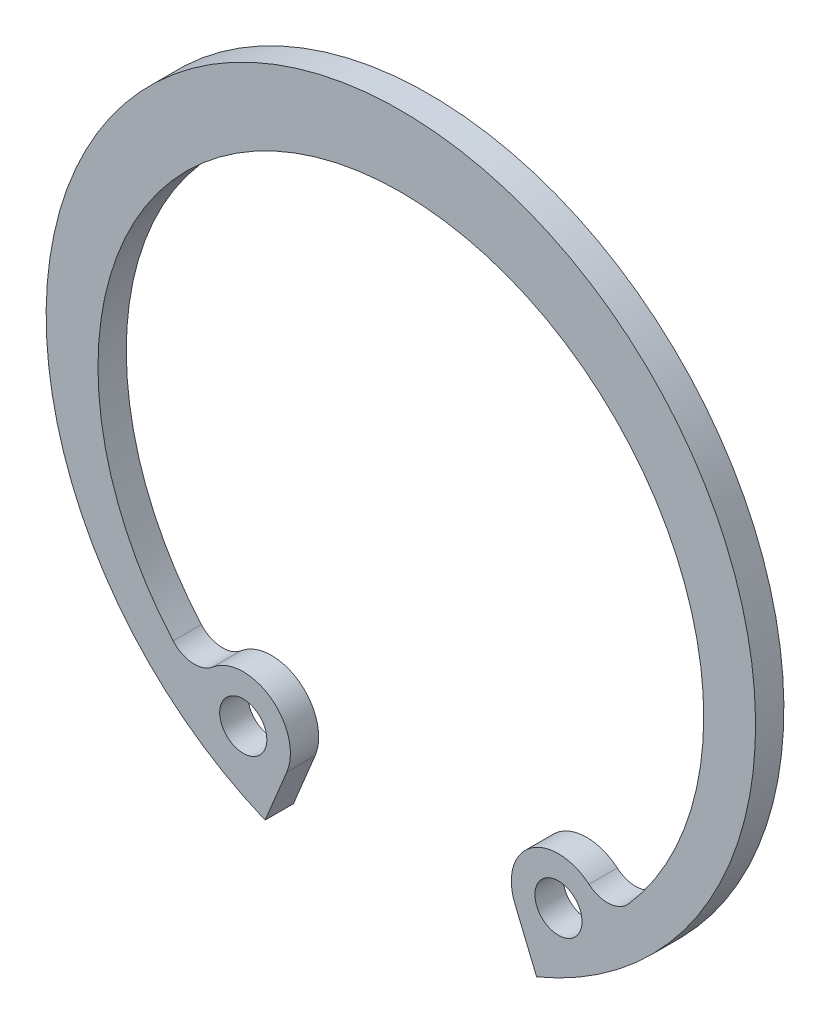
ISO-10303-21;
HEADER;
FILE_DESCRIPTION(('STEP AP214'),'2;1');
FILE_NAME('part.step','',(''),(''),'','','');
FILE_SCHEMA(('AUTOMOTIVE_DESIGN { 1 0 10303 214 1 1 1 1 }'));
ENDSEC;
DATA;
#1=APPLICATION_CONTEXT('core data for automotive mechanical design processes');
#2=APPLICATION_PROTOCOL_DEFINITION('international standard','automotive_design',2000,#1);
#3=PRODUCT_CONTEXT('',#1,'mechanical');
#4=PRODUCT('Part','Part','',(#3));
#5=PRODUCT_RELATED_PRODUCT_CATEGORY('part','',(#4));
#6=PRODUCT_DEFINITION_FORMATION('','',#4);
#7=PRODUCT_DEFINITION_CONTEXT('part definition',#1,'design');
#8=PRODUCT_DEFINITION('design','',#6,#7);
#9=PRODUCT_DEFINITION_SHAPE('','',#8);
#10=(LENGTH_UNIT() NAMED_UNIT(*) SI_UNIT(.MILLI.,.METRE.));
#11=(NAMED_UNIT(*) PLANE_ANGLE_UNIT() SI_UNIT($,.RADIAN.));
#12=(NAMED_UNIT(*) SI_UNIT($,.STERADIAN.) SOLID_ANGLE_UNIT());
#13=UNCERTAINTY_MEASURE_WITH_UNIT(LENGTH_MEASURE(1.E-05),#10,'distance_accuracy_value','');
#14=(GEOMETRIC_REPRESENTATION_CONTEXT(3) GLOBAL_UNCERTAINTY_ASSIGNED_CONTEXT((#13)) GLOBAL_UNIT_ASSIGNED_CONTEXT((#10,
#11,#12)) REPRESENTATION_CONTEXT('',''));
#15=CARTESIAN_POINT('',(0.,0.,0.));
#16=DIRECTION('',(0.,0.,1.));
#17=DIRECTION('',(1.,0.,0.));
#18=AXIS2_PLACEMENT_3D('',#15,#16,#17);
#19=CARTESIAN_POINT('',(0.,0.,-1.2));
#20=DIRECTION('',(0.,0.,1.));
#21=DIRECTION('',(1.,0.,0.));
#22=AXIS2_PLACEMENT_3D('',#19,#20,#21);
#23=CYLINDRICAL_SURFACE('',#22,15.05);
#24=CARTESIAN_POINT('',(0.,0.,0.));
#25=DIRECTION('',(0.,0.,1.));
#26=DIRECTION('',(1.,0.,0.));
#27=AXIS2_PLACEMENT_3D('',#24,#25,#26);
#28=CIRCLE('',#27,15.05);
#29=CARTESIAN_POINT('',(5.75938565709461,-13.9043869642949,0.));
#30=VERTEX_POINT('',#29);
#31=CARTESIAN_POINT('',(-5.75938565709461,-13.9043869642949,0.));
#32=VERTEX_POINT('',#31);
#33=EDGE_CURVE('E158',#30,#32,#28,.T.);
#34=ORIENTED_EDGE('',*,*,#33,.F.);
#35=DIRECTION('',(0.,0.,1.));
#36=VECTOR('',#35,1.);
#37=CARTESIAN_POINT('',(5.75938565709461,-13.9043869642949,-1.2));
#38=LINE('',#37,#36);
#39=CARTESIAN_POINT('',(5.75938565709461,-13.9043869642949,-1.2));
#40=VERTEX_POINT('',#39);
#41=EDGE_CURVE('E11',#40,#30,#38,.T.);
#42=ORIENTED_EDGE('',*,*,#41,.F.);
#43=CARTESIAN_POINT('',(0.,0.,-1.2));
#44=DIRECTION('',(0.,0.,1.));
#45=DIRECTION('',(1.,0.,0.));
#46=AXIS2_PLACEMENT_3D('',#43,#44,#45);
#47=CIRCLE('',#46,15.05);
#48=CARTESIAN_POINT('',(-5.75938565709461,-13.9043869642949,-1.2));
#49=VERTEX_POINT('',#48);
#50=EDGE_CURVE('E187',#40,#49,#47,.T.);
#51=ORIENTED_EDGE('',*,*,#50,.T.);
#52=DIRECTION('',(0.,0.,1.));
#53=VECTOR('',#52,1.);
#54=CARTESIAN_POINT('',(-5.75938565709461,-13.9043869642949,-1.2));
#55=LINE('',#54,#53);
#56=EDGE_CURVE('E44',#49,#32,#55,.T.);
#57=ORIENTED_EDGE('',*,*,#56,.T.);
#58=EDGE_LOOP('',(#34,#42,#51,#57));
#59=FACE_BOUND('',#58,.T.);
#60=ADVANCED_FACE('F41',(#59),#23,.T.);
#61=CARTESIAN_POINT('',(4.8381841684222,-11.6804098366636,-1.2));
#62=DIRECTION('',(-0.923879532511287,-0.38268343236509,0.));
#63=DIRECTION('',(0.38268343236509,-0.923879532511287,0.));
#64=AXIS2_PLACEMENT_3D('',#61,#62,#63);
#65=PLANE('',#64);
#66=DIRECTION('',(0.38268343236509,-0.923879532511287,0.));
#67=VECTOR('',#66,1.);
#68=CARTESIAN_POINT('',(4.8381841684222,-11.6804098366636,0.));
#69=LINE('',#68,#67);
#70=CARTESIAN_POINT('',(4.83818416842221,-11.6804098366636,0.));
#71=VERTEX_POINT('',#70);
#72=EDGE_CURVE('E184',#71,#30,#69,.T.);
#73=ORIENTED_EDGE('',*,*,#72,.F.);
#74=DIRECTION('',(0.,0.,1.));
#75=VECTOR('',#74,1.);
#76=CARTESIAN_POINT('',(4.83818416842221,-11.6804098366636,-1.2));
#77=LINE('',#76,#75);
#78=CARTESIAN_POINT('',(4.83818416842221,-11.6804098366636,-1.2));
#79=VERTEX_POINT('',#78);
#80=EDGE_CURVE('E51',#79,#71,#77,.T.);
#81=ORIENTED_EDGE('',*,*,#80,.F.);
#82=DIRECTION('',(0.38268343236509,-0.923879532511287,0.));
#83=VECTOR('',#82,1.);
#84=CARTESIAN_POINT('',(4.8381841684222,-11.6804098366636,-1.2));
#85=LINE('',#84,#83);
#86=EDGE_CURVE('E143',#79,#40,#85,.T.);
#87=ORIENTED_EDGE('',*,*,#86,.T.);
#88=ORIENTED_EDGE('',*,*,#41,.T.);
#89=EDGE_LOOP('',(#73,#81,#87,#88));
#90=FACE_BOUND('',#89,.T.);
#91=ADVANCED_FACE('F204',(#90),#65,.T.);
#92=CARTESIAN_POINT('',(6.68594323344478,-10.9150429719335,-1.2));
#93=DIRECTION('',(0.,0.,1.));
#94=DIRECTION('',(1.,0.,0.));
#95=AXIS2_PLACEMENT_3D('',#92,#93,#94);
#96=CYLINDRICAL_SURFACE('',#95,2.);
#97=CARTESIAN_POINT('',(6.68594323344478,-10.9150429719335,0.));
#98=DIRECTION('',(0.,0.,1.));
#99=DIRECTION('',(-1.,0.,0.));
#100=AXIS2_PLACEMENT_3D('',#97,#98,#99);
#101=CIRCLE('',#100,2.);
#102=CARTESIAN_POINT('',(7.98284993233138,-9.39253418234207,0.));
#103=VERTEX_POINT('',#102);
#104=EDGE_CURVE('E129',#103,#71,#101,.T.);
#105=ORIENTED_EDGE('',*,*,#104,.F.);
#106=DIRECTION('',(0.,0.,1.));
#107=VECTOR('',#106,1.);
#108=CARTESIAN_POINT('',(7.98284993233138,-9.39253418234207,-1.2));
#109=LINE('',#108,#107);
#110=CARTESIAN_POINT('',(7.98284993233138,-9.39253418234207,-1.2));
#111=VERTEX_POINT('',#110);
#112=EDGE_CURVE('E124',#111,#103,#109,.T.);
#113=ORIENTED_EDGE('',*,*,#112,.F.);
#114=CARTESIAN_POINT('',(6.68594323344478,-10.9150429719335,-1.2));
#115=DIRECTION('',(0.,0.,1.));
#116=DIRECTION('',(-1.,0.,0.));
#117=AXIS2_PLACEMENT_3D('',#114,#115,#116);
#118=CIRCLE('',#117,2.);
#119=EDGE_CURVE('E127',#111,#79,#118,.T.);
#120=ORIENTED_EDGE('',*,*,#119,.T.);
#121=ORIENTED_EDGE('',*,*,#80,.T.);
#122=EDGE_LOOP('',(#105,#113,#120,#121));
#123=FACE_BOUND('',#122,.T.);
#124=ADVANCED_FACE('F126',(#123),#96,.T.);
#125=CARTESIAN_POINT('',(8.76099395166334,-8.47902890858723,-1.2));
#126=DIRECTION('',(0.,0.,1.));
#127=DIRECTION('',(1.,0.,0.));
#128=AXIS2_PLACEMENT_3D('',#125,#126,#127);
#129=CYLINDRICAL_SURFACE('',#128,1.2);
#130=CARTESIAN_POINT('',(8.76099395166334,-8.47902890858723,0.));
#131=DIRECTION('',(0.,0.,-1.));
#132=DIRECTION('',(-1.,0.,0.));
#133=AXIS2_PLACEMENT_3D('',#130,#131,#132);
#134=CIRCLE('',#133,1.2);
#135=CARTESIAN_POINT('',(9.66341392951708,-9.27000184337733,0.));
#136=VERTEX_POINT('',#135);
#137=EDGE_CURVE('E179',#136,#103,#134,.T.);
#138=ORIENTED_EDGE('',*,*,#137,.F.);
#139=DIRECTION('',(0.,0.,1.));
#140=VECTOR('',#139,1.);
#141=CARTESIAN_POINT('',(9.66341392951708,-9.27000184337733,-1.2));
#142=LINE('',#141,#140);
#143=CARTESIAN_POINT('',(9.66341392951708,-9.27000184337733,-1.2));
#144=VERTEX_POINT('',#143);
#145=EDGE_CURVE('E135',#144,#136,#142,.T.);
#146=ORIENTED_EDGE('',*,*,#145,.F.);
#147=CARTESIAN_POINT('',(8.76099395166334,-8.47902890858723,-1.2));
#148=DIRECTION('',(0.,0.,-1.));
#149=DIRECTION('',(-1.,0.,0.));
#150=AXIS2_PLACEMENT_3D('',#147,#148,#149);
#151=CIRCLE('',#150,1.2);
#152=EDGE_CURVE('E141',#144,#111,#151,.T.);
#153=ORIENTED_EDGE('',*,*,#152,.T.);
#154=ORIENTED_EDGE('',*,*,#112,.T.);
#155=EDGE_LOOP('',(#138,#146,#153,#154));
#156=FACE_BOUND('',#155,.T.);
#157=ADVANCED_FACE('F146',(#156),#129,.F.);
#158=CARTESIAN_POINT('',(0.,-0.8,-1.2));
#159=DIRECTION('',(0.,0.,1.));
#160=DIRECTION('',(1.,0.,0.));
#161=AXIS2_PLACEMENT_3D('',#158,#159,#160);
#162=CYLINDRICAL_SURFACE('',#161,12.85);
#163=CARTESIAN_POINT('',(0.,-0.8,0.));
#164=DIRECTION('',(0.,0.,-1.));
#165=DIRECTION('',(1.,0.,0.));
#166=AXIS2_PLACEMENT_3D('',#163,#164,#165);
#167=CIRCLE('',#166,12.85);
#168=CARTESIAN_POINT('',(-9.66341392951707,-9.27000184337733,0.));
#169=VERTEX_POINT('',#168);
#170=EDGE_CURVE('E175',#169,#136,#167,.T.);
#171=ORIENTED_EDGE('',*,*,#170,.F.);
#172=DIRECTION('',(0.,0.,1.));
#173=VECTOR('',#172,1.);
#174=CARTESIAN_POINT('',(-9.66341392951707,-9.27000184337733,-1.2));
#175=LINE('',#174,#173);
#176=CARTESIAN_POINT('',(-9.66341392951707,-9.27000184337733,-1.2));
#177=VERTEX_POINT('',#176);
#178=EDGE_CURVE('E193',#177,#169,#175,.T.);
#179=ORIENTED_EDGE('',*,*,#178,.F.);
#180=CARTESIAN_POINT('',(0.,-0.8,-1.2));
#181=DIRECTION('',(0.,0.,-1.));
#182=DIRECTION('',(1.,0.,0.));
#183=AXIS2_PLACEMENT_3D('',#180,#181,#182);
#184=CIRCLE('',#183,12.85);
#185=EDGE_CURVE('E148',#177,#144,#184,.T.);
#186=ORIENTED_EDGE('',*,*,#185,.T.);
#187=ORIENTED_EDGE('',*,*,#145,.T.);
#188=EDGE_LOOP('',(#171,#179,#186,#187));
#189=FACE_BOUND('',#188,.T.);
#190=ADVANCED_FACE('F217',(#189),#162,.F.);
#191=CARTESIAN_POINT('',(-8.76099395166334,-8.47902890858723,-1.2));
#192=DIRECTION('',(0.,0.,1.));
#193=DIRECTION('',(1.,0.,0.));
#194=AXIS2_PLACEMENT_3D('',#191,#192,#193);
#195=CYLINDRICAL_SURFACE('',#194,1.2);
#196=CARTESIAN_POINT('',(-8.76099395166334,-8.47902890858723,0.));
#197=DIRECTION('',(0.,0.,-1.));
#198=DIRECTION('',(1.,0.,0.));
#199=AXIS2_PLACEMENT_3D('',#196,#197,#198);
#200=CIRCLE('',#199,1.2);
#201=CARTESIAN_POINT('',(-7.98284993233138,-9.39253418234207,0.));
#202=VERTEX_POINT('',#201);
#203=EDGE_CURVE('E171',#202,#169,#200,.T.);
#204=ORIENTED_EDGE('',*,*,#203,.F.);
#205=DIRECTION('',(0.,0.,1.));
#206=VECTOR('',#205,1.);
#207=CARTESIAN_POINT('',(-7.98284993233138,-9.39253418234207,-1.2));
#208=LINE('',#207,#206);
#209=CARTESIAN_POINT('',(-7.98284993233138,-9.39253418234207,-1.2));
#210=VERTEX_POINT('',#209);
#211=EDGE_CURVE('E196',#210,#202,#208,.T.);
#212=ORIENTED_EDGE('',*,*,#211,.F.);
#213=CARTESIAN_POINT('',(-8.76099395166334,-8.47902890858723,-1.2));
#214=DIRECTION('',(0.,0.,-1.));
#215=DIRECTION('',(1.,0.,0.));
#216=AXIS2_PLACEMENT_3D('',#213,#214,#215);
#217=CIRCLE('',#216,1.2);
#218=EDGE_CURVE('E152',#210,#177,#217,.T.);
#219=ORIENTED_EDGE('',*,*,#218,.T.);
#220=ORIENTED_EDGE('',*,*,#178,.T.);
#221=EDGE_LOOP('',(#204,#212,#219,#220));
#222=FACE_BOUND('',#221,.T.);
#223=ADVANCED_FACE('F220',(#222),#195,.F.);
#224=CARTESIAN_POINT('',(-6.68594323344477,-10.9150429719335,-1.2));
#225=DIRECTION('',(0.,0.,1.));
#226=DIRECTION('',(1.,0.,0.));
#227=AXIS2_PLACEMENT_3D('',#224,#225,#226);
#228=CYLINDRICAL_SURFACE('',#227,2.);
#229=CARTESIAN_POINT('',(-6.68594323344477,-10.9150429719335,0.));
#230=DIRECTION('',(0.,0.,1.));
#231=DIRECTION('',(1.,0.,0.));
#232=AXIS2_PLACEMENT_3D('',#229,#230,#231);
#233=CIRCLE('',#232,2.);
#234=CARTESIAN_POINT('',(-4.8381841684222,-11.6804098366636,0.));
#235=VERTEX_POINT('',#234);
#236=EDGE_CURVE('E167',#235,#202,#233,.T.);
#237=ORIENTED_EDGE('',*,*,#236,.F.);
#238=DIRECTION('',(0.,0.,1.));
#239=VECTOR('',#238,1.);
#240=CARTESIAN_POINT('',(-4.8381841684222,-11.6804098366636,-1.2));
#241=LINE('',#240,#239);
#242=CARTESIAN_POINT('',(-4.8381841684222,-11.6804098366636,-1.2));
#243=VERTEX_POINT('',#242);
#244=EDGE_CURVE('E198',#243,#235,#241,.T.);
#245=ORIENTED_EDGE('',*,*,#244,.F.);
#246=CARTESIAN_POINT('',(-6.68594323344477,-10.9150429719335,-1.2));
#247=DIRECTION('',(0.,0.,1.));
#248=DIRECTION('',(1.,0.,0.));
#249=AXIS2_PLACEMENT_3D('',#246,#247,#248);
#250=CIRCLE('',#249,2.);
#251=EDGE_CURVE('E270',#243,#210,#250,.T.);
#252=ORIENTED_EDGE('',*,*,#251,.T.);
#253=ORIENTED_EDGE('',*,*,#211,.T.);
#254=EDGE_LOOP('',(#237,#245,#252,#253));
#255=FACE_BOUND('',#254,.T.);
#256=ADVANCED_FACE('F224',(#255),#228,.T.);
#257=CARTESIAN_POINT('',(-4.8381841684222,-11.6804098366636,-1.2));
#258=DIRECTION('',(0.923879532511287,-0.38268343236509,0.));
#259=DIRECTION('',(0.38268343236509,0.923879532511287,0.));
#260=AXIS2_PLACEMENT_3D('',#257,#258,#259);
#261=PLANE('',#260);
#262=DIRECTION('',(0.38268343236509,0.923879532511287,0.));
#263=VECTOR('',#262,1.);
#264=CARTESIAN_POINT('',(-4.8381841684222,-11.6804098366636,0.));
#265=LINE('',#264,#263);
#266=EDGE_CURVE('E162',#32,#235,#265,.T.);
#267=ORIENTED_EDGE('',*,*,#266,.F.);
#268=ORIENTED_EDGE('',*,*,#56,.F.);
#269=DIRECTION('',(0.38268343236509,0.923879532511287,0.));
#270=VECTOR('',#269,1.);
#271=CARTESIAN_POINT('',(-4.8381841684222,-11.6804098366636,-1.2));
#272=LINE('',#271,#270);
#273=EDGE_CURVE('E268',#49,#243,#272,.T.);
#274=ORIENTED_EDGE('',*,*,#273,.T.);
#275=ORIENTED_EDGE('',*,*,#244,.T.);
#276=EDGE_LOOP('',(#267,#268,#274,#275));
#277=FACE_BOUND('',#276,.T.);
#278=ADVANCED_FACE('F201',(#277),#261,.T.);
#279=CARTESIAN_POINT('',(0.,0.,-1.2));
#280=DIRECTION('',(0.,0.,1.));
#281=DIRECTION('',(1.,0.,0.));
#282=AXIS2_PLACEMENT_3D('',#279,#280,#281);
#283=PLANE('',#282);
#284=CARTESIAN_POINT('',(-6.68594323344477,-10.9150429719335,-1.2));
#285=DIRECTION('',(0.,0.,1.));
#286=DIRECTION('',(1.,0.,0.));
#287=AXIS2_PLACEMENT_3D('',#284,#285,#286);
#288=CIRCLE('',#287,1.);
#289=CARTESIAN_POINT('',(-5.68594323344477,-10.9150429719335,-1.2));
#290=VERTEX_POINT('',#289);
#291=EDGE_CURVE('E251',#290,#290,#288,.T.);
#292=ORIENTED_EDGE('',*,*,#291,.T.);
#293=EDGE_LOOP('',(#292));
#294=FACE_BOUND('',#293,.T.);
#295=CARTESIAN_POINT('',(6.68594323344478,-10.9150429719335,-1.2));
#296=DIRECTION('',(0.,0.,1.));
#297=DIRECTION('',(-1.,0.,0.));
#298=AXIS2_PLACEMENT_3D('',#295,#296,#297);
#299=CIRCLE('',#298,1.);
#300=CARTESIAN_POINT('',(5.68594323344478,-10.9150429719335,-1.2));
#301=VERTEX_POINT('',#300);
#302=EDGE_CURVE('E163',#301,#301,#299,.T.);
#303=ORIENTED_EDGE('',*,*,#302,.T.);
#304=EDGE_LOOP('',(#303));
#305=FACE_BOUND('',#304,.T.);
#306=ORIENTED_EDGE('',*,*,#50,.F.);
#307=ORIENTED_EDGE('',*,*,#86,.F.);
#308=ORIENTED_EDGE('',*,*,#119,.F.);
#309=ORIENTED_EDGE('',*,*,#152,.F.);
#310=ORIENTED_EDGE('',*,*,#185,.F.);
#311=ORIENTED_EDGE('',*,*,#218,.F.);
#312=ORIENTED_EDGE('',*,*,#251,.F.);
#313=ORIENTED_EDGE('',*,*,#273,.F.);
#314=EDGE_LOOP('',(#306,#307,#308,#309,#310,#311,#312,#313));
#315=FACE_BOUND('',#314,.T.);
#316=ADVANCED_FACE('F139',(#294,#305,#315),#283,.F.);
#317=CARTESIAN_POINT('',(0.,0.,0.));
#318=DIRECTION('',(0.,0.,1.));
#319=DIRECTION('',(1.,0.,0.));
#320=AXIS2_PLACEMENT_3D('',#317,#318,#319);
#321=PLANE('',#320);
#322=CARTESIAN_POINT('',(-6.68594323344477,-10.9150429719335,0.));
#323=DIRECTION('',(0.,0.,1.));
#324=DIRECTION('',(1.,0.,0.));
#325=AXIS2_PLACEMENT_3D('',#322,#323,#324);
#326=CIRCLE('',#325,1.);
#327=CARTESIAN_POINT('',(-5.68594323344477,-10.9150429719335,0.));
#328=VERTEX_POINT('',#327);
#329=EDGE_CURVE('E254',#328,#328,#326,.T.);
#330=ORIENTED_EDGE('',*,*,#329,.F.);
#331=EDGE_LOOP('',(#330));
#332=FACE_BOUND('',#331,.T.);
#333=CARTESIAN_POINT('',(6.68594323344478,-10.9150429719335,0.));
#334=DIRECTION('',(0.,0.,1.));
#335=DIRECTION('',(-1.,0.,0.));
#336=AXIS2_PLACEMENT_3D('',#333,#334,#335);
#337=CIRCLE('',#336,1.);
#338=CARTESIAN_POINT('',(5.68594323344478,-10.9150429719335,0.));
#339=VERTEX_POINT('',#338);
#340=EDGE_CURVE('E258',#339,#339,#337,.T.);
#341=ORIENTED_EDGE('',*,*,#340,.F.);
#342=EDGE_LOOP('',(#341));
#343=FACE_BOUND('',#342,.T.);
#344=ORIENTED_EDGE('',*,*,#33,.T.);
#345=ORIENTED_EDGE('',*,*,#266,.T.);
#346=ORIENTED_EDGE('',*,*,#236,.T.);
#347=ORIENTED_EDGE('',*,*,#203,.T.);
#348=ORIENTED_EDGE('',*,*,#170,.T.);
#349=ORIENTED_EDGE('',*,*,#137,.T.);
#350=ORIENTED_EDGE('',*,*,#104,.T.);
#351=ORIENTED_EDGE('',*,*,#72,.T.);
#352=EDGE_LOOP('',(#344,#345,#346,#347,#348,#349,#350,#351));
#353=FACE_BOUND('',#352,.T.);
#354=ADVANCED_FACE('F203',(#332,#343,#353),#321,.T.);
#355=CARTESIAN_POINT('',(6.68594323344478,-10.9150429719335,-1.2));
#356=DIRECTION('',(0.,0.,1.));
#357=DIRECTION('',(1.,0.,0.));
#358=AXIS2_PLACEMENT_3D('',#355,#356,#357);
#359=CYLINDRICAL_SURFACE('',#358,1.);
#360=ORIENTED_EDGE('',*,*,#302,.F.);
#361=EDGE_LOOP('',(#360));
#362=FACE_BOUND('',#361,.T.);
#363=ORIENTED_EDGE('',*,*,#340,.T.);
#364=EDGE_LOOP('',(#363));
#365=FACE_BOUND('',#364,.T.);
#366=ADVANCED_FACE('F236',(#362,#365),#359,.F.);
#367=CARTESIAN_POINT('',(-6.68594323344477,-10.9150429719335,-1.2));
#368=DIRECTION('',(0.,0.,1.));
#369=DIRECTION('',(1.,0.,0.));
#370=AXIS2_PLACEMENT_3D('',#367,#368,#369);
#371=CYLINDRICAL_SURFACE('',#370,1.);
#372=ORIENTED_EDGE('',*,*,#291,.F.);
#373=EDGE_LOOP('',(#372));
#374=FACE_BOUND('',#373,.T.);
#375=ORIENTED_EDGE('',*,*,#329,.T.);
#376=EDGE_LOOP('',(#375));
#377=FACE_BOUND('',#376,.T.);
#378=ADVANCED_FACE('F243',(#374,#377),#371,.F.);
#379=CLOSED_SHELL('',(#60,#91,#124,#157,#190,#223,#256,#278,#316,#354,#366,#378));
#380=MANIFOLD_SOLID_BREP('B2',#379);
#381=ADVANCED_BREP_SHAPE_REPRESENTATION('',(#18,#380),#14);
#382=SHAPE_DEFINITION_REPRESENTATION(#9,#381);
ENDSEC;
END-ISO-10303-21;
